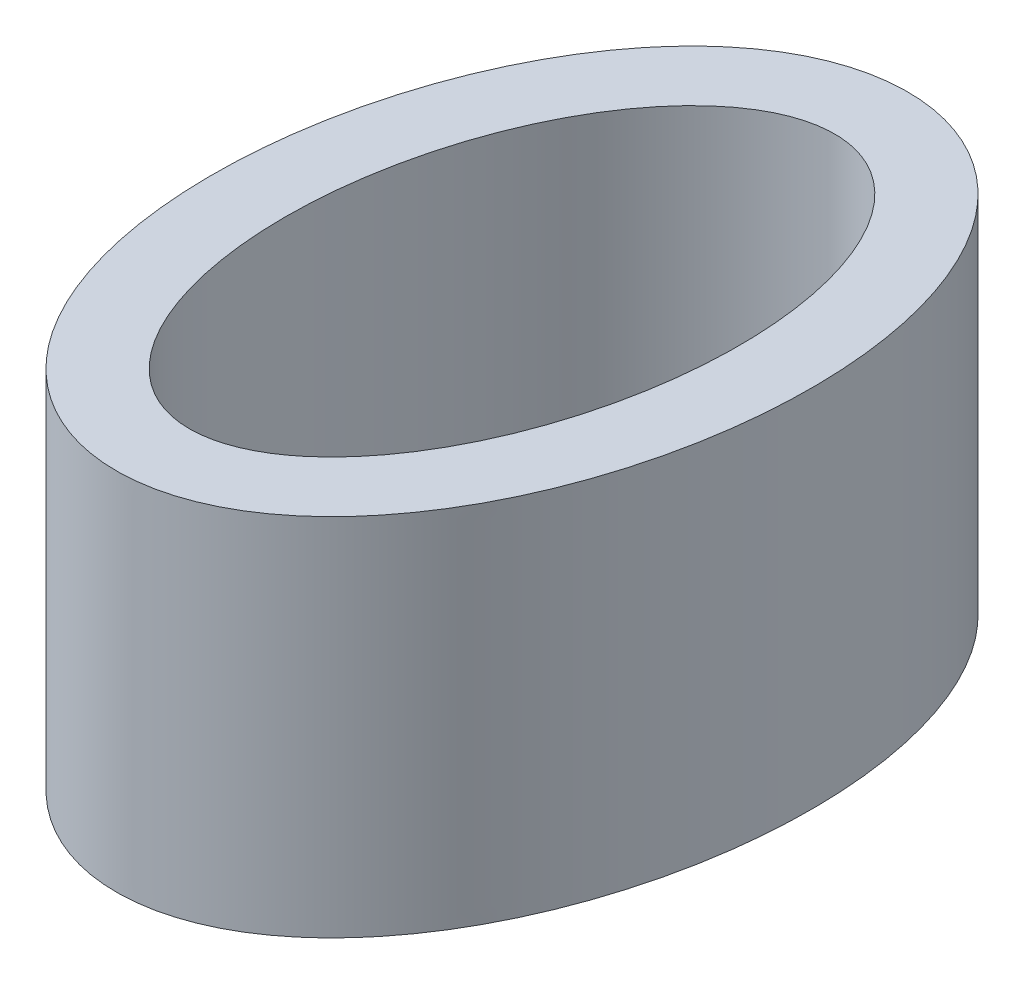
ISO-10303-21;
HEADER;
FILE_DESCRIPTION(('STEP AP214'),'2;1');
FILE_NAME('part.step','',(''),(''),'','','');
FILE_SCHEMA(('AUTOMOTIVE_DESIGN { 1 0 10303 214 1 1 1 1 }'));
ENDSEC;
DATA;
#1=APPLICATION_CONTEXT('core data for automotive mechanical design processes');
#2=APPLICATION_PROTOCOL_DEFINITION('international standard','automotive_design',2000,#1);
#3=PRODUCT_CONTEXT('',#1,'mechanical');
#4=PRODUCT('Part','Part','',(#3));
#5=PRODUCT_RELATED_PRODUCT_CATEGORY('part','',(#4));
#6=PRODUCT_DEFINITION_FORMATION('','',#4);
#7=PRODUCT_DEFINITION_CONTEXT('part definition',#1,'design');
#8=PRODUCT_DEFINITION('design','',#6,#7);
#9=PRODUCT_DEFINITION_SHAPE('','',#8);
#10=(LENGTH_UNIT() NAMED_UNIT(*) SI_UNIT(.MILLI.,.METRE.));
#11=(NAMED_UNIT(*) PLANE_ANGLE_UNIT() SI_UNIT($,.RADIAN.));
#12=(NAMED_UNIT(*) SI_UNIT($,.STERADIAN.) SOLID_ANGLE_UNIT());
#13=UNCERTAINTY_MEASURE_WITH_UNIT(LENGTH_MEASURE(1.E-05),#10,'distance_accuracy_value','');
#14=(GEOMETRIC_REPRESENTATION_CONTEXT(3) GLOBAL_UNCERTAINTY_ASSIGNED_CONTEXT((#13)) GLOBAL_UNIT_ASSIGNED_CONTEXT((#10,
#11,#12)) REPRESENTATION_CONTEXT('',''));
#15=CARTESIAN_POINT('',(0.,0.,0.));
#16=DIRECTION('',(0.,0.,1.));
#17=DIRECTION('',(1.,0.,0.));
#18=AXIS2_PLACEMENT_3D('',#15,#16,#17);
#19=CARTESIAN_POINT('',(0.,20.,0.));
#20=DIRECTION('',(0.,1.,0.));
#21=DIRECTION('',(0.169906916507648,0.,-0.985460115744348));
#22=AXIS2_PLACEMENT_3D('',#19,#20,#21);
#23=ELLIPSE('',#22,16.,9.);
#24=DIRECTION('',(0.,-1.,0.));
#25=VECTOR('',#24,1.);
#26=SURFACE_OF_LINEAR_EXTRUSION('',#23,#25);
#27=CARTESIAN_POINT('',(0.,3.,0.));
#28=DIRECTION('',(0.,1.,0.));
#29=DIRECTION('',(0.169906916507648,0.,-0.985460115744348));
#30=AXIS2_PLACEMENT_3D('',#27,#28,#29);
#31=ELLIPSE('',#30,16.,9.);
#32=CARTESIAN_POINT('',(2.71851066412237,3.,-15.7673618519096));
#33=VERTEX_POINT('',#32);
#34=EDGE_CURVE('E10',#33,#33,#31,.T.);
#35=ORIENTED_EDGE('',*,*,#34,.F.);
#36=EDGE_LOOP('',(#35));
#37=FACE_BOUND('',#36,.T.);
#38=CARTESIAN_POINT('',(2.71851066412237,20.,-15.7673618519096));
#39=VERTEX_POINT('',#38);
#40=EDGE_CURVE('E42',#39,#39,#23,.T.);
#41=ORIENTED_EDGE('',*,*,#40,.T.);
#42=EDGE_LOOP('',(#41));
#43=FACE_BOUND('',#42,.T.);
#44=ADVANCED_FACE('F31',(#37,#43),#26,.T.);
#45=CARTESIAN_POINT('',(3.39813833015297,20.,-19.709202314887));
#46=CARTESIAN_POINT('',(2.36045113489317,20.,-19.8881139002766));
#47=CARTESIAN_POINT('',(0.220628961523931,20.,-19.8721399305278));
#48=CARTESIAN_POINT('',(-2.73749683662298,20.,-18.8490924016641));
#49=CARTESIAN_POINT('',(-5.30613641187994,20.,-17.1080158565341));
#50=CARTESIAN_POINT('',(-8.2413430317742,20.,-14.0678571636985));
#51=CARTESIAN_POINT('',(-11.0707666341109,20.,-9.17972507829147));
#52=CARTESIAN_POINT('',(-13.0723759084931,20.,-2.25385791525747));
#53=CARTESIAN_POINT('',(-13.5056187599757,20.,4.94241725172476));
#54=CARTESIAN_POINT('',(-12.4764601517325,20.,10.4958221320593));
#55=CARTESIAN_POINT('',(-10.7287897349757,20.,14.3433734174211));
#56=CARTESIAN_POINT('',(-8.89149447478868,20.,16.8440938996965));
#57=CARTESIAN_POINT('',(-6.44675213308269,20.,18.7986704181901));
#58=CARTESIAN_POINT('',(-3.4303622215778,20.,19.896100885151));
#59=CARTESIAN_POINT('',(-0.22062896152393,20.,19.8721399305278));
#60=CARTESIAN_POINT('',(2.73749683662298,20.,18.8490924016641));
#61=CARTESIAN_POINT('',(5.30613641187993,20.,17.1080158565341));
#62=CARTESIAN_POINT('',(8.2413430317742,20.,14.0678571636984));
#63=CARTESIAN_POINT('',(11.0707666341108,20.,9.17972507829148));
#64=CARTESIAN_POINT('',(13.0723759084931,20.,2.25385791525747));
#65=CARTESIAN_POINT('',(13.5056187599757,20.,-4.94241725172476));
#66=CARTESIAN_POINT('',(12.4764601517325,20.,-10.4958221320593));
#67=CARTESIAN_POINT('',(10.7287897349757,20.,-14.3433734174211));
#68=CARTESIAN_POINT('',(8.89149447478868,20.,-16.8440938996965));
#69=CARTESIAN_POINT('',(6.4467521330827,20.,-18.7986704181901));
#70=CARTESIAN_POINT('',(4.43582552541276,20.,-19.5302907294973));
#71=CARTESIAN_POINT('',(3.39813833015297,20.,-19.709202314887));
#72=B_SPLINE_CURVE_WITH_KNOTS('',3,(#45,#46,#47,#48,#49,#50,#51,#52,#53,#54,#55,#56,#57,#58,#59,
#60,#61,#62,#63,#64,#65,#66,#67,#68,#69,#70,#71),.UNSPECIFIED.,.T.,.F.,(4,1,1,1,1,1,1,1,1,1,1,1,
1,1,1,1,1,1,1,1,1,1,1,1,4),(0.,0.196349540849362,0.392699081698724,0.589048622548086,
0.785398163397448,1.17809724509617,1.5707963267949,1.96349540849362,2.35619449019234,
2.55254403104171,2.74889357189107,2.94524311274043,3.14159265358979,3.33794219443916,
3.53429173528852,3.73064127613788,3.92699081698724,4.31968989868597,4.71238898038469,
5.10508806208341,5.49778714378214,5.6941366846315,5.89048622548086,6.08683576633022,
6.28318530717959),.UNSPECIFIED.);
#73=DIRECTION('',(0.,-1.,0.));
#74=VECTOR('',#73,1.);
#75=SURFACE_OF_LINEAR_EXTRUSION('',#72,#74);
#76=CARTESIAN_POINT('',(3.39813833015297,20.,-19.709202314887));
#77=VERTEX_POINT('',#76);
#78=EDGE_CURVE('E38',#77,#77,#72,.T.);
#79=ORIENTED_EDGE('',*,*,#78,.F.);
#80=EDGE_LOOP('',(#79));
#81=FACE_BOUND('',#80,.T.);
#82=CARTESIAN_POINT('',(3.39813833015297,0.,-19.709202314887));
#83=CARTESIAN_POINT('',(2.36045113489317,0.,-19.8881139002766));
#84=CARTESIAN_POINT('',(0.220628961523931,0.,-19.8721399305278));
#85=CARTESIAN_POINT('',(-2.73749683662298,0.,-18.8490924016641));
#86=CARTESIAN_POINT('',(-5.30613641187994,0.,-17.1080158565341));
#87=CARTESIAN_POINT('',(-8.2413430317742,0.,-14.0678571636985));
#88=CARTESIAN_POINT('',(-11.0707666341109,0.,-9.17972507829147));
#89=CARTESIAN_POINT('',(-13.0723759084931,0.,-2.25385791525747));
#90=CARTESIAN_POINT('',(-13.5056187599757,0.,4.94241725172476));
#91=CARTESIAN_POINT('',(-12.4764601517325,0.,10.4958221320593));
#92=CARTESIAN_POINT('',(-10.7287897349757,0.,14.3433734174211));
#93=CARTESIAN_POINT('',(-8.89149447478868,0.,16.8440938996965));
#94=CARTESIAN_POINT('',(-6.44675213308269,0.,18.7986704181901));
#95=CARTESIAN_POINT('',(-3.4303622215778,0.,19.896100885151));
#96=CARTESIAN_POINT('',(-0.22062896152393,0.,19.8721399305278));
#97=CARTESIAN_POINT('',(2.73749683662298,0.,18.8490924016641));
#98=CARTESIAN_POINT('',(5.30613641187993,0.,17.1080158565341));
#99=CARTESIAN_POINT('',(8.2413430317742,0.,14.0678571636984));
#100=CARTESIAN_POINT('',(11.0707666341108,0.,9.17972507829148));
#101=CARTESIAN_POINT('',(13.0723759084931,0.,2.25385791525747));
#102=CARTESIAN_POINT('',(13.5056187599757,0.,-4.94241725172476));
#103=CARTESIAN_POINT('',(12.4764601517325,0.,-10.4958221320593));
#104=CARTESIAN_POINT('',(10.7287897349757,0.,-14.3433734174211));
#105=CARTESIAN_POINT('',(8.89149447478868,0.,-16.8440938996965));
#106=CARTESIAN_POINT('',(6.4467521330827,0.,-18.7986704181901));
#107=CARTESIAN_POINT('',(4.43582552541276,0.,-19.5302907294973));
#108=CARTESIAN_POINT('',(3.39813833015297,0.,-19.709202314887));
#109=B_SPLINE_CURVE_WITH_KNOTS('',3,(#82,#83,#84,#85,#86,#87,#88,#89,#90,#91,#92,#93,#94,#95,
#96,#97,#98,#99,#100,#101,#102,#103,#104,#105,#106,#107,#108),.UNSPECIFIED.,.T.,.F.,(4,1,1,1,1,
1,1,1,1,1,1,1,1,1,1,1,1,1,1,1,1,1,1,1,4),(0.,0.196349540849362,0.392699081698724,
0.589048622548086,0.785398163397448,1.17809724509617,1.5707963267949,1.96349540849362,
2.35619449019234,2.55254403104171,2.74889357189107,2.94524311274043,3.14159265358979,
3.33794219443916,3.53429173528852,3.73064127613788,3.92699081698724,4.31968989868597,
4.71238898038469,5.10508806208341,5.49778714378214,5.6941366846315,5.89048622548086,
6.08683576633022,6.28318530717959),.UNSPECIFIED.);
#110=CARTESIAN_POINT('',(3.39813833015297,0.,-19.709202314887));
#111=VERTEX_POINT('',#110);
#112=EDGE_CURVE('E47',#111,#111,#109,.T.);
#113=ORIENTED_EDGE('',*,*,#112,.T.);
#114=EDGE_LOOP('',(#113));
#115=FACE_BOUND('',#114,.T.);
#116=ADVANCED_FACE('F57',(#81,#115),#75,.F.);
#117=CARTESIAN_POINT('',(0.,20.,0.));
#118=DIRECTION('',(0.,1.,0.));
#119=DIRECTION('',(0.,0.,1.));
#120=AXIS2_PLACEMENT_3D('',#117,#118,#119);
#121=PLANE('',#120);
#122=ORIENTED_EDGE('',*,*,#40,.F.);
#123=EDGE_LOOP('',(#122));
#124=FACE_BOUND('',#123,.T.);
#125=ORIENTED_EDGE('',*,*,#78,.T.);
#126=EDGE_LOOP('',(#125));
#127=FACE_BOUND('',#126,.T.);
#128=ADVANCED_FACE('F60',(#124,#127),#121,.T.);
#129=CARTESIAN_POINT('',(0.,0.,0.));
#130=DIRECTION('',(0.,1.,0.));
#131=DIRECTION('',(0.,0.,1.));
#132=AXIS2_PLACEMENT_3D('',#129,#130,#131);
#133=PLANE('',#132);
#134=ORIENTED_EDGE('',*,*,#112,.F.);
#135=EDGE_LOOP('',(#134));
#136=FACE_BOUND('',#135,.T.);
#137=ADVANCED_FACE('F62',(#136),#133,.F.);
#138=CARTESIAN_POINT('',(0.,3.,0.));
#139=DIRECTION('',(0.,1.,0.));
#140=DIRECTION('',(0.,0.,1.));
#141=AXIS2_PLACEMENT_3D('',#138,#139,#140);
#142=PLANE('',#141);
#143=ORIENTED_EDGE('',*,*,#34,.T.);
#144=EDGE_LOOP('',(#143));
#145=FACE_BOUND('',#144,.T.);
#146=ADVANCED_FACE('F65',(#145),#142,.T.);
#147=CLOSED_SHELL('',(#44,#116,#128,#137,#146));
#148=MANIFOLD_SOLID_BREP('B2',#147);
#149=ADVANCED_BREP_SHAPE_REPRESENTATION('',(#18,#148),#14);
#150=SHAPE_DEFINITION_REPRESENTATION(#9,#149);
ENDSEC;
END-ISO-10303-21;
